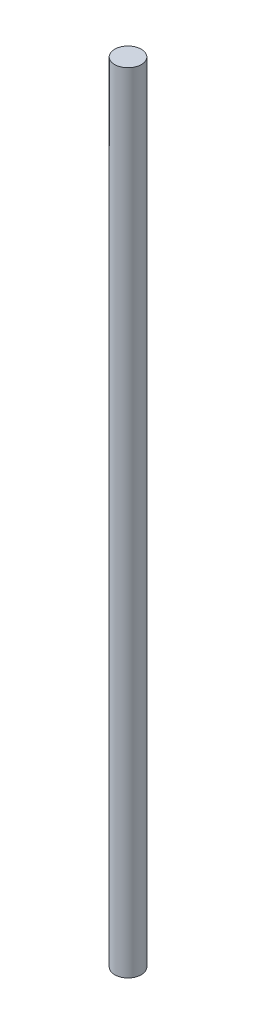
ISO-10303-21;
HEADER;
FILE_DESCRIPTION(('STEP AP214'),'2;1');
FILE_NAME('part.step','',(''),(''),'','','');
FILE_SCHEMA(('AUTOMOTIVE_DESIGN { 1 0 10303 214 1 1 1 1 }'));
ENDSEC;
DATA;
#1=APPLICATION_CONTEXT('core data for automotive mechanical design processes');
#2=APPLICATION_PROTOCOL_DEFINITION('international standard','automotive_design',2000,#1);
#3=PRODUCT_CONTEXT('',#1,'mechanical');
#4=PRODUCT('Part','Part','',(#3));
#5=PRODUCT_RELATED_PRODUCT_CATEGORY('part','',(#4));
#6=PRODUCT_DEFINITION_FORMATION('','',#4);
#7=PRODUCT_DEFINITION_CONTEXT('part definition',#1,'design');
#8=PRODUCT_DEFINITION('design','',#6,#7);
#9=PRODUCT_DEFINITION_SHAPE('','',#8);
#10=(LENGTH_UNIT() NAMED_UNIT(*) SI_UNIT(.MILLI.,.METRE.));
#11=(NAMED_UNIT(*) PLANE_ANGLE_UNIT() SI_UNIT($,.RADIAN.));
#12=(NAMED_UNIT(*) SI_UNIT($,.STERADIAN.) SOLID_ANGLE_UNIT());
#13=UNCERTAINTY_MEASURE_WITH_UNIT(LENGTH_MEASURE(1.E-05),#10,'distance_accuracy_value','');
#14=(GEOMETRIC_REPRESENTATION_CONTEXT(3) GLOBAL_UNCERTAINTY_ASSIGNED_CONTEXT((#13)) GLOBAL_UNIT_ASSIGNED_CONTEXT((#10,
#11,#12)) REPRESENTATION_CONTEXT('',''));
#15=CARTESIAN_POINT('',(0.,0.,0.));
#16=DIRECTION('',(0.,0.,1.));
#17=DIRECTION('',(1.,0.,0.));
#18=AXIS2_PLACEMENT_3D('',#15,#16,#17);
#19=CARTESIAN_POINT('',(0.,0.,0.));
#20=DIRECTION('',(0.,1.,0.));
#21=DIRECTION('',(0.,0.,1.));
#22=AXIS2_PLACEMENT_3D('',#19,#20,#21);
#23=PLANE('',#22);
#24=CARTESIAN_POINT('',(0.,0.,0.));
#25=DIRECTION('',(0.,-1.,0.));
#26=DIRECTION('',(0.,0.,-1.));
#27=AXIS2_PLACEMENT_3D('',#24,#25,#26);
#28=CIRCLE('',#27,1.3);
#29=CARTESIAN_POINT('',(0.,0.,-1.3));
#30=VERTEX_POINT('',#29);
#31=EDGE_CURVE('E10',#30,#30,#28,.T.);
#32=ORIENTED_EDGE('',*,*,#31,.F.);
#33=EDGE_LOOP('',(#32));
#34=FACE_BOUND('',#33,.T.);
#35=ADVANCED_FACE('F31',(#34),#23,.T.);
#36=CARTESIAN_POINT('',(0.,-81.,0.));
#37=DIRECTION('',(0.,-1.,0.));
#38=DIRECTION('',(0.,0.,-1.));
#39=AXIS2_PLACEMENT_3D('',#36,#37,#38);
#40=CYLINDRICAL_SURFACE('',#39,1.3);
#41=ORIENTED_EDGE('',*,*,#31,.T.);
#42=EDGE_LOOP('',(#41));
#43=FACE_BOUND('',#42,.T.);
#44=CARTESIAN_POINT('',(0.,-77.,0.));
#45=DIRECTION('',(0.,-1.,0.));
#46=DIRECTION('',(0.,0.,-1.));
#47=AXIS2_PLACEMENT_3D('',#44,#45,#46);
#48=CIRCLE('',#47,1.3);
#49=CARTESIAN_POINT('',(0.,-77.,-1.3));
#50=VERTEX_POINT('',#49);
#51=EDGE_CURVE('E37',#50,#50,#48,.T.);
#52=ORIENTED_EDGE('',*,*,#51,.F.);
#53=EDGE_LOOP('',(#52));
#54=FACE_BOUND('',#53,.T.);
#55=ADVANCED_FACE('F45',(#43,#54),#40,.T.);
#56=CARTESIAN_POINT('',(1.3,-77.,0.));
#57=DIRECTION('',(0.,-1.,0.));
#58=DIRECTION('',(0.,0.,-1.));
#59=AXIS2_PLACEMENT_3D('',#56,#57,#58);
#60=PLANE('',#59);
#61=ORIENTED_EDGE('',*,*,#51,.T.);
#62=EDGE_LOOP('',(#61));
#63=FACE_BOUND('',#62,.T.);
#64=ADVANCED_FACE('F43',(#63),#60,.T.);
#65=CLOSED_SHELL('',(#35,#55,#64));
#66=MANIFOLD_SOLID_BREP('B2',#65);
#67=ADVANCED_BREP_SHAPE_REPRESENTATION('',(#18,#66),#14);
#68=SHAPE_DEFINITION_REPRESENTATION(#9,#67);
ENDSEC;
END-ISO-10303-21;
